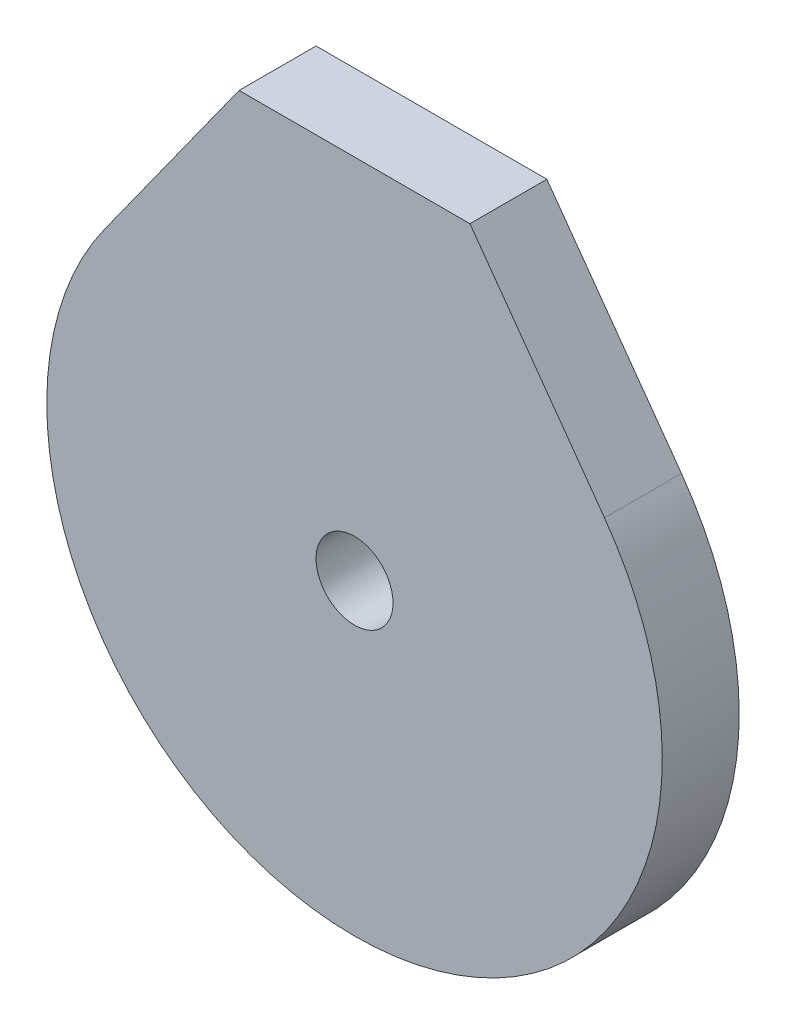
ISO-10303-21;
HEADER;
FILE_DESCRIPTION(('STEP AP214'),'2;1');
FILE_NAME('part.step','',(''),(''),'','','');
FILE_SCHEMA(('AUTOMOTIVE_DESIGN { 1 0 10303 214 1 1 1 1 }'));
ENDSEC;
DATA;
#1=APPLICATION_CONTEXT('core data for automotive mechanical design processes');
#2=APPLICATION_PROTOCOL_DEFINITION('international standard','automotive_design',2000,#1);
#3=PRODUCT_CONTEXT('',#1,'mechanical');
#4=PRODUCT('Part','Part','',(#3));
#5=PRODUCT_RELATED_PRODUCT_CATEGORY('part','',(#4));
#6=PRODUCT_DEFINITION_FORMATION('','',#4);
#7=PRODUCT_DEFINITION_CONTEXT('part definition',#1,'design');
#8=PRODUCT_DEFINITION('design','',#6,#7);
#9=PRODUCT_DEFINITION_SHAPE('','',#8);
#10=(LENGTH_UNIT() NAMED_UNIT(*) SI_UNIT(.MILLI.,.METRE.));
#11=(NAMED_UNIT(*) PLANE_ANGLE_UNIT() SI_UNIT($,.RADIAN.));
#12=(NAMED_UNIT(*) SI_UNIT($,.STERADIAN.) SOLID_ANGLE_UNIT());
#13=UNCERTAINTY_MEASURE_WITH_UNIT(LENGTH_MEASURE(1.E-05),#10,'distance_accuracy_value','');
#14=(GEOMETRIC_REPRESENTATION_CONTEXT(3) GLOBAL_UNCERTAINTY_ASSIGNED_CONTEXT((#13)) GLOBAL_UNIT_ASSIGNED_CONTEXT((#10,
#11,#12)) REPRESENTATION_CONTEXT('',''));
#15=CARTESIAN_POINT('',(0.,0.,0.));
#16=DIRECTION('',(0.,0.,1.));
#17=DIRECTION('',(1.,0.,0.));
#18=AXIS2_PLACEMENT_3D('',#15,#16,#17);
#19=CARTESIAN_POINT('',(0.,0.,5.));
#20=DIRECTION('',(0.,0.,1.));
#21=DIRECTION('',(1.,0.,0.));
#22=AXIS2_PLACEMENT_3D('',#19,#20,#21);
#23=PLANE('',#22);
#24=CARTESIAN_POINT('',(0.,0.,5.));
#25=DIRECTION('',(0.,0.,1.));
#26=DIRECTION('',(1.,0.,0.));
#27=AXIS2_PLACEMENT_3D('',#24,#25,#26);
#28=CIRCLE('',#27,40.);
#29=CARTESIAN_POINT('',(-32.4945408340067,23.3260544453423,5.));
#30=VERTEX_POINT('',#29);
#31=CARTESIAN_POINT('',(32.4945408340067,23.3260544453423,5.));
#32=VERTEX_POINT('',#31);
#33=EDGE_CURVE('E89',#30,#32,#28,.T.);
#34=ORIENTED_EDGE('',*,*,#33,.T.);
#35=DIRECTION('',(-0.583151361133557,0.812363520850167,0.));
#36=VECTOR('',#35,1.);
#37=CARTESIAN_POINT('',(15.,47.6969600708473,5.));
#38=LINE('',#37,#36);
#39=CARTESIAN_POINT('',(15.,47.6969600708473,5.));
#40=VERTEX_POINT('',#39);
#41=EDGE_CURVE('E84',#32,#40,#38,.T.);
#42=ORIENTED_EDGE('',*,*,#41,.T.);
#43=DIRECTION('',(-1.,0.,0.));
#44=VECTOR('',#43,1.);
#45=CARTESIAN_POINT('',(-15.,47.6969600708473,5.));
#46=LINE('',#45,#44);
#47=CARTESIAN_POINT('',(-15.,47.6969600708473,5.));
#48=VERTEX_POINT('',#47);
#49=EDGE_CURVE('E87',#40,#48,#46,.T.);
#50=ORIENTED_EDGE('',*,*,#49,.T.);
#51=DIRECTION('',(-0.583151361133557,-0.812363520850167,0.));
#52=VECTOR('',#51,1.);
#53=CARTESIAN_POINT('',(-32.4945408340067,23.3260544453423,5.));
#54=LINE('',#53,#52);
#55=EDGE_CURVE('E54',#48,#30,#54,.T.);
#56=ORIENTED_EDGE('',*,*,#55,.T.);
#57=EDGE_LOOP('',(#34,#42,#50,#56));
#58=FACE_BOUND('',#57,.T.);
#59=CARTESIAN_POINT('',(0.,0.,5.));
#60=DIRECTION('',(0.,0.,1.));
#61=DIRECTION('',(1.,0.,0.));
#62=AXIS2_PLACEMENT_3D('',#59,#60,#61);
#63=CIRCLE('',#62,5.);
#64=CARTESIAN_POINT('',(5.,0.,5.));
#65=VERTEX_POINT('',#64);
#66=EDGE_CURVE('E104',#65,#65,#63,.T.);
#67=ORIENTED_EDGE('',*,*,#66,.F.);
#68=EDGE_LOOP('',(#67));
#69=FACE_BOUND('',#68,.T.);
#70=ADVANCED_FACE('F37',(#58,#69),#23,.T.);
#71=CARTESIAN_POINT('',(0.,0.,-5.));
#72=DIRECTION('',(0.,0.,1.));
#73=DIRECTION('',(1.,0.,0.));
#74=AXIS2_PLACEMENT_3D('',#71,#72,#73);
#75=PLANE('',#74);
#76=CARTESIAN_POINT('',(0.,0.,-5.));
#77=DIRECTION('',(0.,0.,1.));
#78=DIRECTION('',(1.,0.,0.));
#79=AXIS2_PLACEMENT_3D('',#76,#77,#78);
#80=CIRCLE('',#79,40.);
#81=CARTESIAN_POINT('',(-32.4945408340067,23.3260544453423,-5.));
#82=VERTEX_POINT('',#81);
#83=CARTESIAN_POINT('',(32.4945408340067,23.3260544453423,-5.));
#84=VERTEX_POINT('',#83);
#85=EDGE_CURVE('E101',#82,#84,#80,.T.);
#86=ORIENTED_EDGE('',*,*,#85,.F.);
#87=DIRECTION('',(-0.583151361133557,-0.812363520850167,0.));
#88=VECTOR('',#87,1.);
#89=CARTESIAN_POINT('',(-32.4945408340067,23.3260544453423,-5.));
#90=LINE('',#89,#88);
#91=CARTESIAN_POINT('',(-15.,47.6969600708473,-5.));
#92=VERTEX_POINT('',#91);
#93=EDGE_CURVE('E77',#92,#82,#90,.T.);
#94=ORIENTED_EDGE('',*,*,#93,.F.);
#95=DIRECTION('',(-1.,0.,0.));
#96=VECTOR('',#95,1.);
#97=CARTESIAN_POINT('',(-15.,47.6969600708473,-5.));
#98=LINE('',#97,#96);
#99=CARTESIAN_POINT('',(15.,47.6969600708473,-5.));
#100=VERTEX_POINT('',#99);
#101=EDGE_CURVE('E71',#100,#92,#98,.T.);
#102=ORIENTED_EDGE('',*,*,#101,.F.);
#103=DIRECTION('',(-0.583151361133557,0.812363520850167,0.));
#104=VECTOR('',#103,1.);
#105=CARTESIAN_POINT('',(15.,47.6969600708473,-5.));
#106=LINE('',#105,#104);
#107=EDGE_CURVE('E93',#84,#100,#106,.T.);
#108=ORIENTED_EDGE('',*,*,#107,.F.);
#109=EDGE_LOOP('',(#86,#94,#102,#108));
#110=FACE_BOUND('',#109,.T.);
#111=CARTESIAN_POINT('',(0.,0.,-5.));
#112=DIRECTION('',(0.,0.,1.));
#113=DIRECTION('',(1.,0.,0.));
#114=AXIS2_PLACEMENT_3D('',#111,#112,#113);
#115=CIRCLE('',#114,5.);
#116=CARTESIAN_POINT('',(5.,0.,-5.));
#117=VERTEX_POINT('',#116);
#118=EDGE_CURVE('E116',#117,#117,#115,.T.);
#119=ORIENTED_EDGE('',*,*,#118,.T.);
#120=EDGE_LOOP('',(#119));
#121=FACE_BOUND('',#120,.T.);
#122=ADVANCED_FACE('F112',(#110,#121),#75,.F.);
#123=CARTESIAN_POINT('',(0.,0.,5.));
#124=DIRECTION('',(0.,0.,-1.));
#125=DIRECTION('',(-1.,0.,0.));
#126=AXIS2_PLACEMENT_3D('',#123,#124,#125);
#127=CYLINDRICAL_SURFACE('',#126,40.);
#128=ORIENTED_EDGE('',*,*,#85,.T.);
#129=DIRECTION('',(0.,0.,-1.));
#130=VECTOR('',#129,1.);
#131=CARTESIAN_POINT('',(32.4945408340067,23.3260544453423,5.));
#132=LINE('',#131,#130);
#133=EDGE_CURVE('E11',#32,#84,#132,.T.);
#134=ORIENTED_EDGE('',*,*,#133,.F.);
#135=ORIENTED_EDGE('',*,*,#33,.F.);
#136=DIRECTION('',(0.,0.,-1.));
#137=VECTOR('',#136,1.);
#138=CARTESIAN_POINT('',(-32.4945408340067,23.3260544453423,5.));
#139=LINE('',#138,#137);
#140=EDGE_CURVE('E97',#30,#82,#139,.T.);
#141=ORIENTED_EDGE('',*,*,#140,.T.);
#142=EDGE_LOOP('',(#128,#134,#135,#141));
#143=FACE_BOUND('',#142,.T.);
#144=ADVANCED_FACE('F39',(#143),#127,.T.);
#145=CARTESIAN_POINT('',(15.,47.6969600708473,5.));
#146=DIRECTION('',(-0.812363520850167,-0.583151361133557,0.));
#147=DIRECTION('',(0.583151361133557,-0.812363520850167,0.));
#148=AXIS2_PLACEMENT_3D('',#145,#146,#147);
#149=PLANE('',#148);
#150=ORIENTED_EDGE('',*,*,#107,.T.);
#151=DIRECTION('',(0.,0.,-1.));
#152=VECTOR('',#151,1.);
#153=CARTESIAN_POINT('',(15.,47.6969600708473,5.));
#154=LINE('',#153,#152);
#155=EDGE_CURVE('E46',#40,#100,#154,.T.);
#156=ORIENTED_EDGE('',*,*,#155,.F.);
#157=ORIENTED_EDGE('',*,*,#41,.F.);
#158=ORIENTED_EDGE('',*,*,#133,.T.);
#159=EDGE_LOOP('',(#150,#156,#157,#158));
#160=FACE_BOUND('',#159,.T.);
#161=ADVANCED_FACE('F92',(#160),#149,.F.);
#162=CARTESIAN_POINT('',(-15.,47.6969600708473,5.));
#163=DIRECTION('',(0.,-1.,0.));
#164=DIRECTION('',(0.,0.,-1.));
#165=AXIS2_PLACEMENT_3D('',#162,#163,#164);
#166=PLANE('',#165);
#167=ORIENTED_EDGE('',*,*,#101,.T.);
#168=DIRECTION('',(0.,0.,-1.));
#169=VECTOR('',#168,1.);
#170=CARTESIAN_POINT('',(-15.,47.6969600708473,5.));
#171=LINE('',#170,#169);
#172=EDGE_CURVE('E94',#48,#92,#171,.T.);
#173=ORIENTED_EDGE('',*,*,#172,.F.);
#174=ORIENTED_EDGE('',*,*,#49,.F.);
#175=ORIENTED_EDGE('',*,*,#155,.T.);
#176=EDGE_LOOP('',(#167,#173,#174,#175));
#177=FACE_BOUND('',#176,.T.);
#178=ADVANCED_FACE('F95',(#177),#166,.F.);
#179=CARTESIAN_POINT('',(-32.4945408340067,23.3260544453423,5.));
#180=DIRECTION('',(0.812363520850167,-0.583151361133557,0.));
#181=DIRECTION('',(0.583151361133557,0.812363520850167,0.));
#182=AXIS2_PLACEMENT_3D('',#179,#180,#181);
#183=PLANE('',#182);
#184=ORIENTED_EDGE('',*,*,#93,.T.);
#185=ORIENTED_EDGE('',*,*,#140,.F.);
#186=ORIENTED_EDGE('',*,*,#55,.F.);
#187=ORIENTED_EDGE('',*,*,#172,.T.);
#188=EDGE_LOOP('',(#184,#185,#186,#187));
#189=FACE_BOUND('',#188,.T.);
#190=ADVANCED_FACE('F109',(#189),#183,.F.);
#191=CARTESIAN_POINT('',(0.,0.,5.));
#192=DIRECTION('',(0.,0.,-1.));
#193=DIRECTION('',(-1.,0.,0.));
#194=AXIS2_PLACEMENT_3D('',#191,#192,#193);
#195=CYLINDRICAL_SURFACE('',#194,5.);
#196=ORIENTED_EDGE('',*,*,#66,.T.);
#197=EDGE_LOOP('',(#196));
#198=FACE_BOUND('',#197,.T.);
#199=ORIENTED_EDGE('',*,*,#118,.F.);
#200=EDGE_LOOP('',(#199));
#201=FACE_BOUND('',#200,.T.);
#202=ADVANCED_FACE('F122',(#198,#201),#195,.F.);
#203=CLOSED_SHELL('',(#70,#122,#144,#161,#178,#190,#202));
#204=MANIFOLD_SOLID_BREP('B2',#203);
#205=ADVANCED_BREP_SHAPE_REPRESENTATION('',(#18,#204),#14);
#206=SHAPE_DEFINITION_REPRESENTATION(#9,#205);
ENDSEC;
END-ISO-10303-21;
